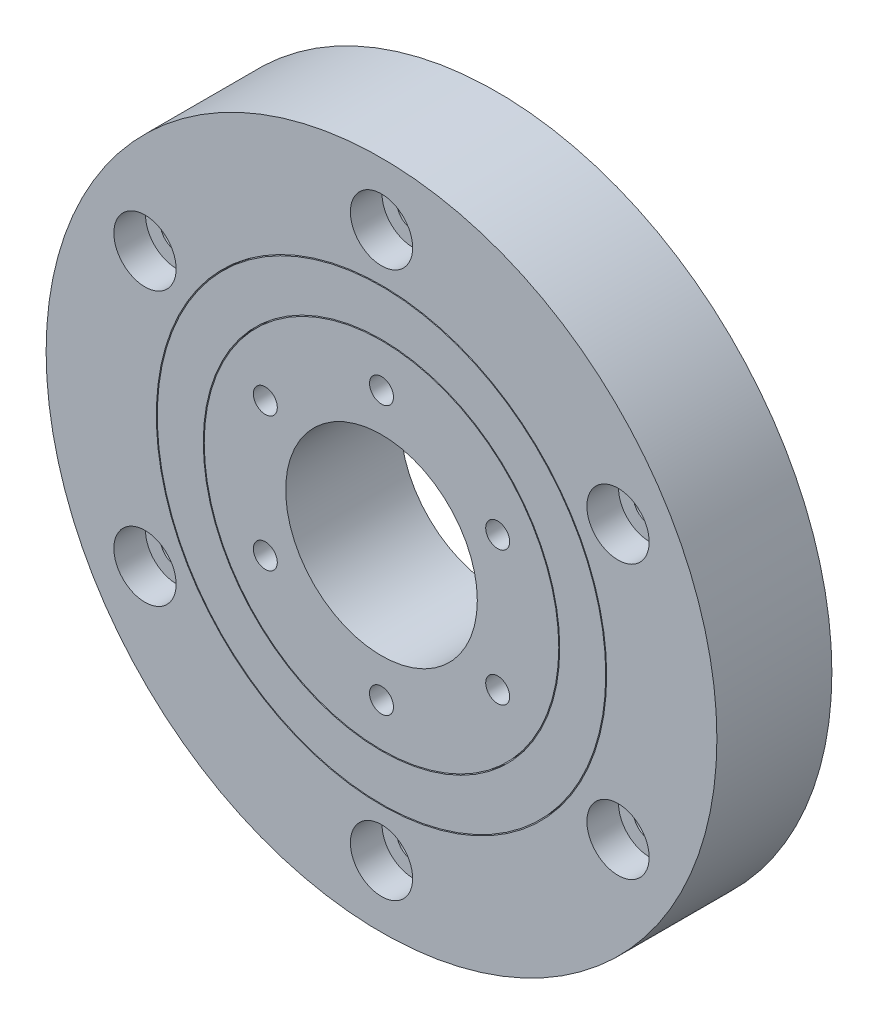
ISO-10303-21;
HEADER;
FILE_DESCRIPTION(('STEP AP214'),'2;1');
FILE_NAME('part.step','',(''),(''),'','','');
FILE_SCHEMA(('AUTOMOTIVE_DESIGN { 1 0 10303 214 1 1 1 1 }'));
ENDSEC;
DATA;
#1=APPLICATION_CONTEXT('core data for automotive mechanical design processes');
#2=APPLICATION_PROTOCOL_DEFINITION('international standard','automotive_design',2000,#1);
#3=PRODUCT_CONTEXT('',#1,'mechanical');
#4=PRODUCT('Part','Part','',(#3));
#5=PRODUCT_RELATED_PRODUCT_CATEGORY('part','',(#4));
#6=PRODUCT_DEFINITION_FORMATION('','',#4);
#7=PRODUCT_DEFINITION_CONTEXT('part definition',#1,'design');
#8=PRODUCT_DEFINITION('design','',#6,#7);
#9=PRODUCT_DEFINITION_SHAPE('','',#8);
#10=(LENGTH_UNIT() NAMED_UNIT(*) SI_UNIT(.MILLI.,.METRE.));
#11=(NAMED_UNIT(*) PLANE_ANGLE_UNIT() SI_UNIT($,.RADIAN.));
#12=(NAMED_UNIT(*) SI_UNIT($,.STERADIAN.) SOLID_ANGLE_UNIT());
#13=UNCERTAINTY_MEASURE_WITH_UNIT(LENGTH_MEASURE(1.E-05),#10,'distance_accuracy_value','');
#14=(GEOMETRIC_REPRESENTATION_CONTEXT(3) GLOBAL_UNCERTAINTY_ASSIGNED_CONTEXT((#13)) GLOBAL_UNIT_ASSIGNED_CONTEXT((#10,
#11,#12)) REPRESENTATION_CONTEXT('',''));
#15=CARTESIAN_POINT('',(0.,0.,0.));
#16=DIRECTION('',(0.,0.,1.));
#17=DIRECTION('',(1.,0.,0.));
#18=AXIS2_PLACEMENT_3D('',#15,#16,#17);
#19=CARTESIAN_POINT('',(0.,0.,11.5));
#20=DIRECTION('',(0.,0.,1.));
#21=DIRECTION('',(1.,0.,0.));
#22=AXIS2_PLACEMENT_3D('',#19,#20,#21);
#23=CYLINDRICAL_SURFACE('',#22,23.4);
#24=CARTESIAN_POINT('',(0.,0.,11.5));
#25=DIRECTION('',(0.,0.,1.));
#26=DIRECTION('',(1.,0.,0.));
#27=AXIS2_PLACEMENT_3D('',#24,#25,#26);
#28=CIRCLE('',#27,23.4);
#29=CARTESIAN_POINT('',(23.4,0.,11.5));
#30=VERTEX_POINT('',#29);
#31=EDGE_CURVE('E11',#30,#30,#28,.T.);
#32=ORIENTED_EDGE('',*,*,#31,.T.);
#33=EDGE_LOOP('',(#32));
#34=FACE_BOUND('',#33,.T.);
#35=CARTESIAN_POINT('',(0.,0.,12.));
#36=DIRECTION('',(0.,0.,1.));
#37=DIRECTION('',(1.,0.,0.));
#38=AXIS2_PLACEMENT_3D('',#35,#36,#37);
#39=CIRCLE('',#38,23.4);
#40=CARTESIAN_POINT('',(23.4,0.,12.));
#41=VERTEX_POINT('',#40);
#42=EDGE_CURVE('E51',#41,#41,#39,.T.);
#43=ORIENTED_EDGE('',*,*,#42,.F.);
#44=EDGE_LOOP('',(#43));
#45=FACE_BOUND('',#44,.T.);
#46=ADVANCED_FACE('F48',(#34,#45),#23,.T.);
#47=CARTESIAN_POINT('',(0.,0.,11.5));
#48=DIRECTION('',(0.,0.,1.));
#49=DIRECTION('',(1.,0.,0.));
#50=AXIS2_PLACEMENT_3D('',#47,#48,#49);
#51=PLANE('',#50);
#52=CARTESIAN_POINT('',(0.,0.,11.5));
#53=DIRECTION('',(0.,0.,1.));
#54=DIRECTION('',(1.,0.,0.));
#55=AXIS2_PLACEMENT_3D('',#52,#53,#54);
#56=CIRCLE('',#55,18.6);
#57=CARTESIAN_POINT('',(18.6,0.,11.5));
#58=VERTEX_POINT('',#57);
#59=EDGE_CURVE('E59',#58,#58,#56,.T.);
#60=ORIENTED_EDGE('',*,*,#59,.T.);
#61=EDGE_LOOP('',(#60));
#62=FACE_BOUND('',#61,.T.);
#63=ORIENTED_EDGE('',*,*,#31,.F.);
#64=EDGE_LOOP('',(#63));
#65=FACE_BOUND('',#64,.T.);
#66=ADVANCED_FACE('F68',(#62,#65),#51,.F.);
#67=CARTESIAN_POINT('',(0.,0.,12.));
#68=DIRECTION('',(0.,0.,1.));
#69=DIRECTION('',(1.,0.,0.));
#70=AXIS2_PLACEMENT_3D('',#67,#68,#69);
#71=PLANE('',#70);
#72=CARTESIAN_POINT('',(0.,0.,12.));
#73=DIRECTION('',(0.,0.,1.));
#74=DIRECTION('',(1.,0.,0.));
#75=AXIS2_PLACEMENT_3D('',#72,#73,#74);
#76=CIRCLE('',#75,18.6);
#77=CARTESIAN_POINT('',(18.6,0.,12.));
#78=VERTEX_POINT('',#77);
#79=EDGE_CURVE('E58',#78,#78,#76,.T.);
#80=ORIENTED_EDGE('',*,*,#79,.F.);
#81=EDGE_LOOP('',(#80));
#82=FACE_BOUND('',#81,.T.);
#83=ORIENTED_EDGE('',*,*,#42,.T.);
#84=EDGE_LOOP('',(#83));
#85=FACE_BOUND('',#84,.T.);
#86=ADVANCED_FACE('F75',(#82,#85),#71,.T.);
#87=CARTESIAN_POINT('',(0.,0.,11.5));
#88=DIRECTION('',(0.,0.,1.));
#89=DIRECTION('',(1.,0.,0.));
#90=AXIS2_PLACEMENT_3D('',#87,#88,#89);
#91=CYLINDRICAL_SURFACE('',#90,18.6);
#92=ORIENTED_EDGE('',*,*,#59,.F.);
#93=EDGE_LOOP('',(#92));
#94=FACE_BOUND('',#93,.T.);
#95=ORIENTED_EDGE('',*,*,#79,.T.);
#96=EDGE_LOOP('',(#95));
#97=FACE_BOUND('',#96,.T.);
#98=ADVANCED_FACE('F69',(#94,#97),#91,.F.);
#99=CLOSED_SHELL('',(#46,#66,#86,#98));
#100=MANIFOLD_SOLID_BREP('B2',#99);
#101=CARTESIAN_POINT('',(0.,0.,0.5));
#102=DIRECTION('',(0.,0.,1.));
#103=DIRECTION('',(1.,0.,0.));
#104=AXIS2_PLACEMENT_3D('',#101,#102,#103);
#105=PLANE('',#104);
#106=CARTESIAN_POINT('',(0.,0.,0.5));
#107=DIRECTION('',(0.,0.,1.));
#108=DIRECTION('',(1.,0.,0.));
#109=AXIS2_PLACEMENT_3D('',#106,#107,#108);
#110=CIRCLE('',#109,23.4);
#111=CARTESIAN_POINT('',(23.4,0.,0.5));
#112=VERTEX_POINT('',#111);
#113=EDGE_CURVE('E50',#112,#112,#110,.T.);
#114=ORIENTED_EDGE('',*,*,#113,.T.);
#115=EDGE_LOOP('',(#114));
#116=FACE_BOUND('',#115,.T.);
#117=CARTESIAN_POINT('',(0.,0.,0.5));
#118=DIRECTION('',(0.,0.,1.));
#119=DIRECTION('',(1.,0.,0.));
#120=AXIS2_PLACEMENT_3D('',#117,#118,#119);
#121=CIRCLE('',#120,18.6);
#122=CARTESIAN_POINT('',(18.6,0.,0.5));
#123=VERTEX_POINT('',#122);
#124=EDGE_CURVE('E129',#123,#123,#121,.T.);
#125=ORIENTED_EDGE('',*,*,#124,.F.);
#126=EDGE_LOOP('',(#125));
#127=FACE_BOUND('',#126,.T.);
#128=ADVANCED_FACE('F120',(#116,#127),#105,.T.);
#129=CARTESIAN_POINT('',(0.,0.,0.));
#130=DIRECTION('',(0.,0.,1.));
#131=DIRECTION('',(1.,0.,0.));
#132=AXIS2_PLACEMENT_3D('',#129,#130,#131);
#133=PLANE('',#132);
#134=CARTESIAN_POINT('',(0.,0.,0.));
#135=DIRECTION('',(0.,0.,1.));
#136=DIRECTION('',(1.,0.,0.));
#137=AXIS2_PLACEMENT_3D('',#134,#135,#136);
#138=CIRCLE('',#137,23.4);
#139=CARTESIAN_POINT('',(23.4,0.,0.));
#140=VERTEX_POINT('',#139);
#141=EDGE_CURVE('E125',#140,#140,#138,.T.);
#142=ORIENTED_EDGE('',*,*,#141,.F.);
#143=EDGE_LOOP('',(#142));
#144=FACE_BOUND('',#143,.T.);
#145=CARTESIAN_POINT('',(0.,0.,0.));
#146=DIRECTION('',(0.,0.,1.));
#147=DIRECTION('',(1.,0.,0.));
#148=AXIS2_PLACEMENT_3D('',#145,#146,#147);
#149=CIRCLE('',#148,18.6);
#150=CARTESIAN_POINT('',(18.6,0.,0.));
#151=VERTEX_POINT('',#150);
#152=EDGE_CURVE('E132',#151,#151,#149,.T.);
#153=ORIENTED_EDGE('',*,*,#152,.T.);
#154=EDGE_LOOP('',(#153));
#155=FACE_BOUND('',#154,.T.);
#156=ADVANCED_FACE('F143',(#144,#155),#133,.F.);
#157=CARTESIAN_POINT('',(0.,0.,0.5));
#158=DIRECTION('',(0.,0.,-1.));
#159=DIRECTION('',(-1.,0.,0.));
#160=AXIS2_PLACEMENT_3D('',#157,#158,#159);
#161=CYLINDRICAL_SURFACE('',#160,23.4);
#162=ORIENTED_EDGE('',*,*,#113,.F.);
#163=EDGE_LOOP('',(#162));
#164=FACE_BOUND('',#163,.T.);
#165=ORIENTED_EDGE('',*,*,#141,.T.);
#166=EDGE_LOOP('',(#165));
#167=FACE_BOUND('',#166,.T.);
#168=ADVANCED_FACE('F118',(#164,#167),#161,.T.);
#169=CARTESIAN_POINT('',(0.,0.,0.5));
#170=DIRECTION('',(0.,0.,-1.));
#171=DIRECTION('',(-1.,0.,0.));
#172=AXIS2_PLACEMENT_3D('',#169,#170,#171);
#173=CYLINDRICAL_SURFACE('',#172,18.6);
#174=ORIENTED_EDGE('',*,*,#124,.T.);
#175=EDGE_LOOP('',(#174));
#176=FACE_BOUND('',#175,.T.);
#177=ORIENTED_EDGE('',*,*,#152,.F.);
#178=EDGE_LOOP('',(#177));
#179=FACE_BOUND('',#178,.T.);
#180=ADVANCED_FACE('F140',(#176,#179),#173,.F.);
#181=CLOSED_SHELL('',(#128,#156,#168,#180));
#182=MANIFOLD_SOLID_BREP('B6',#181);
#183=CARTESIAN_POINT('',(24.6817240078565,14.25,0.));
#184=DIRECTION('',(0.,0.,1.));
#185=DIRECTION('',(1.,0.,0.));
#186=AXIS2_PLACEMENT_3D('',#183,#184,#185);
#187=CYLINDRICAL_SURFACE('',#186,1.7);
#188=CARTESIAN_POINT('',(24.6817240078565,14.25,0.));
#189=DIRECTION('',(0.,0.,1.));
#190=DIRECTION('',(1.,0.,0.));
#191=AXIS2_PLACEMENT_3D('',#188,#189,#190);
#192=CIRCLE('',#191,1.7);
#193=CARTESIAN_POINT('',(26.3817240078565,14.25,0.));
#194=VERTEX_POINT('',#193);
#195=EDGE_CURVE('E237',#194,#194,#192,.T.);
#196=ORIENTED_EDGE('',*,*,#195,.F.);
#197=EDGE_LOOP('',(#196));
#198=FACE_BOUND('',#197,.T.);
#199=CARTESIAN_POINT('',(24.6817240078565,14.25,8.7));
#200=DIRECTION('',(0.,0.,1.));
#201=DIRECTION('',(1.,0.,0.));
#202=AXIS2_PLACEMENT_3D('',#199,#200,#201);
#203=CIRCLE('',#202,1.7);
#204=CARTESIAN_POINT('',(26.3817240078565,14.25,8.7));
#205=VERTEX_POINT('',#204);
#206=EDGE_CURVE('E193',#205,#205,#203,.F.);
#207=ORIENTED_EDGE('',*,*,#206,.F.);
#208=EDGE_LOOP('',(#207));
#209=FACE_BOUND('',#208,.T.);
#210=ADVANCED_FACE('F189',(#198,#209),#187,.F.);
#211=CARTESIAN_POINT('',(0.,28.5,0.));
#212=DIRECTION('',(0.,0.,1.));
#213=DIRECTION('',(1.,0.,0.));
#214=AXIS2_PLACEMENT_3D('',#211,#212,#213);
#215=CYLINDRICAL_SURFACE('',#214,1.7);
#216=CARTESIAN_POINT('',(0.,28.5,0.));
#217=DIRECTION('',(0.,0.,1.));
#218=DIRECTION('',(1.,0.,0.));
#219=AXIS2_PLACEMENT_3D('',#216,#217,#218);
#220=CIRCLE('',#219,1.7);
#221=CARTESIAN_POINT('',(1.7,28.5,0.));
#222=VERTEX_POINT('',#221);
#223=EDGE_CURVE('E236',#222,#222,#220,.T.);
#224=ORIENTED_EDGE('',*,*,#223,.F.);
#225=EDGE_LOOP('',(#224));
#226=FACE_BOUND('',#225,.T.);
#227=CARTESIAN_POINT('',(0.,28.5,8.7));
#228=DIRECTION('',(0.,0.,1.));
#229=DIRECTION('',(1.,0.,0.));
#230=AXIS2_PLACEMENT_3D('',#227,#228,#229);
#231=CIRCLE('',#230,1.7);
#232=CARTESIAN_POINT('',(1.7,28.5,8.7));
#233=VERTEX_POINT('',#232);
#234=EDGE_CURVE('E217',#233,#233,#231,.F.);
#235=ORIENTED_EDGE('',*,*,#234,.F.);
#236=EDGE_LOOP('',(#235));
#237=FACE_BOUND('',#236,.T.);
#238=ADVANCED_FACE('F263',(#226,#237),#215,.F.);
#239=CARTESIAN_POINT('',(-24.6817240078565,14.25,0.));
#240=DIRECTION('',(0.,0.,1.));
#241=DIRECTION('',(1.,0.,0.));
#242=AXIS2_PLACEMENT_3D('',#239,#240,#241);
#243=CYLINDRICAL_SURFACE('',#242,1.7);
#244=CARTESIAN_POINT('',(-24.6817240078565,14.25,0.));
#245=DIRECTION('',(0.,0.,1.));
#246=DIRECTION('',(1.,0.,0.));
#247=AXIS2_PLACEMENT_3D('',#244,#245,#246);
#248=CIRCLE('',#247,1.7);
#249=CARTESIAN_POINT('',(-22.9817240078565,14.25,0.));
#250=VERTEX_POINT('',#249);
#251=EDGE_CURVE('E376',#250,#250,#248,.T.);
#252=ORIENTED_EDGE('',*,*,#251,.F.);
#253=EDGE_LOOP('',(#252));
#254=FACE_BOUND('',#253,.T.);
#255=CARTESIAN_POINT('',(-24.6817240078565,14.25,8.7));
#256=DIRECTION('',(0.,0.,1.));
#257=DIRECTION('',(1.,0.,0.));
#258=AXIS2_PLACEMENT_3D('',#255,#256,#257);
#259=CIRCLE('',#258,1.7);
#260=CARTESIAN_POINT('',(-22.9817240078565,14.25,8.7));
#261=VERTEX_POINT('',#260);
#262=EDGE_CURVE('E216',#261,#261,#259,.F.);
#263=ORIENTED_EDGE('',*,*,#262,.F.);
#264=EDGE_LOOP('',(#263));
#265=FACE_BOUND('',#264,.T.);
#266=ADVANCED_FACE('F268',(#254,#265),#243,.F.);
#267=CARTESIAN_POINT('',(-24.6817240078565,-14.25,0.));
#268=DIRECTION('',(0.,0.,1.));
#269=DIRECTION('',(1.,0.,0.));
#270=AXIS2_PLACEMENT_3D('',#267,#268,#269);
#271=CYLINDRICAL_SURFACE('',#270,1.7);
#272=CARTESIAN_POINT('',(-24.6817240078565,-14.25,0.));
#273=DIRECTION('',(0.,0.,1.));
#274=DIRECTION('',(1.,0.,0.));
#275=AXIS2_PLACEMENT_3D('',#272,#273,#274);
#276=CIRCLE('',#275,1.7);
#277=CARTESIAN_POINT('',(-22.9817240078565,-14.25,0.));
#278=VERTEX_POINT('',#277);
#279=EDGE_CURVE('E235',#278,#278,#276,.T.);
#280=ORIENTED_EDGE('',*,*,#279,.F.);
#281=EDGE_LOOP('',(#280));
#282=FACE_BOUND('',#281,.T.);
#283=CARTESIAN_POINT('',(-24.6817240078565,-14.25,8.7));
#284=DIRECTION('',(0.,0.,1.));
#285=DIRECTION('',(1.,0.,0.));
#286=AXIS2_PLACEMENT_3D('',#283,#284,#285);
#287=CIRCLE('',#286,1.7);
#288=CARTESIAN_POINT('',(-22.9817240078565,-14.25,8.7));
#289=VERTEX_POINT('',#288);
#290=EDGE_CURVE('E213',#289,#289,#287,.F.);
#291=ORIENTED_EDGE('',*,*,#290,.F.);
#292=EDGE_LOOP('',(#291));
#293=FACE_BOUND('',#292,.T.);
#294=ADVANCED_FACE('F284',(#282,#293),#271,.F.);
#295=CARTESIAN_POINT('',(0.,-28.5,0.));
#296=DIRECTION('',(0.,0.,1.));
#297=DIRECTION('',(1.,0.,0.));
#298=AXIS2_PLACEMENT_3D('',#295,#296,#297);
#299=CYLINDRICAL_SURFACE('',#298,1.7);
#300=CARTESIAN_POINT('',(0.,-28.5,0.));
#301=DIRECTION('',(0.,0.,1.));
#302=DIRECTION('',(1.,0.,0.));
#303=AXIS2_PLACEMENT_3D('',#300,#301,#302);
#304=CIRCLE('',#303,1.7);
#305=CARTESIAN_POINT('',(1.69999999999999,-28.5,0.));
#306=VERTEX_POINT('',#305);
#307=EDGE_CURVE('E229',#306,#306,#304,.T.);
#308=ORIENTED_EDGE('',*,*,#307,.F.);
#309=EDGE_LOOP('',(#308));
#310=FACE_BOUND('',#309,.T.);
#311=CARTESIAN_POINT('',(0.,-28.5,8.7));
#312=DIRECTION('',(0.,0.,1.));
#313=DIRECTION('',(1.,0.,0.));
#314=AXIS2_PLACEMENT_3D('',#311,#312,#313);
#315=CIRCLE('',#314,1.7);
#316=CARTESIAN_POINT('',(1.69999999999999,-28.5,8.7));
#317=VERTEX_POINT('',#316);
#318=EDGE_CURVE('E207',#317,#317,#315,.F.);
#319=ORIENTED_EDGE('',*,*,#318,.F.);
#320=EDGE_LOOP('',(#319));
#321=FACE_BOUND('',#320,.T.);
#322=ADVANCED_FACE('F279',(#310,#321),#299,.F.);
#323=CARTESIAN_POINT('',(24.6817240078565,-14.25,0.));
#324=DIRECTION('',(0.,0.,1.));
#325=DIRECTION('',(1.,0.,0.));
#326=AXIS2_PLACEMENT_3D('',#323,#324,#325);
#327=CYLINDRICAL_SURFACE('',#326,1.7);
#328=CARTESIAN_POINT('',(24.6817240078565,-14.25,0.));
#329=DIRECTION('',(0.,0.,1.));
#330=DIRECTION('',(1.,0.,0.));
#331=AXIS2_PLACEMENT_3D('',#328,#329,#330);
#332=CIRCLE('',#331,1.7);
#333=CARTESIAN_POINT('',(26.3817240078565,-14.25,0.));
#334=VERTEX_POINT('',#333);
#335=EDGE_CURVE('E224',#334,#334,#332,.T.);
#336=ORIENTED_EDGE('',*,*,#335,.F.);
#337=EDGE_LOOP('',(#336));
#338=FACE_BOUND('',#337,.T.);
#339=CARTESIAN_POINT('',(24.6817240078565,-14.25,8.7));
#340=DIRECTION('',(0.,0.,1.));
#341=DIRECTION('',(1.,0.,0.));
#342=AXIS2_PLACEMENT_3D('',#339,#340,#341);
#343=CIRCLE('',#342,1.7);
#344=CARTESIAN_POINT('',(26.3817240078565,-14.25,8.7));
#345=VERTEX_POINT('',#344);
#346=EDGE_CURVE('E206',#345,#345,#343,.F.);
#347=ORIENTED_EDGE('',*,*,#346,.F.);
#348=EDGE_LOOP('',(#347));
#349=FACE_BOUND('',#348,.T.);
#350=ADVANCED_FACE('F273',(#338,#349),#327,.F.);
#351=CARTESIAN_POINT('',(0.,0.,12.));
#352=DIRECTION('',(0.,0.,1.));
#353=DIRECTION('',(1.,0.,0.));
#354=AXIS2_PLACEMENT_3D('',#351,#352,#353);
#355=PLANE('',#354);
#356=CARTESIAN_POINT('',(24.6817240078565,-14.25,12.));
#357=DIRECTION('',(0.,0.,1.));
#358=DIRECTION('',(1.,0.,0.));
#359=AXIS2_PLACEMENT_3D('',#356,#357,#358);
#360=CIRCLE('',#359,3.25);
#361=CARTESIAN_POINT('',(27.9317240078565,-14.25,12.));
#362=VERTEX_POINT('',#361);
#363=EDGE_CURVE('E368',#362,#362,#360,.T.);
#364=ORIENTED_EDGE('',*,*,#363,.F.);
#365=EDGE_LOOP('',(#364));
#366=FACE_BOUND('',#365,.T.);
#367=CARTESIAN_POINT('',(0.,-28.5,12.));
#368=DIRECTION('',(0.,0.,1.));
#369=DIRECTION('',(1.,0.,0.));
#370=AXIS2_PLACEMENT_3D('',#367,#368,#369);
#371=CIRCLE('',#370,3.25);
#372=CARTESIAN_POINT('',(3.24999999999999,-28.5,12.));
#373=VERTEX_POINT('',#372);
#374=EDGE_CURVE('E357',#373,#373,#371,.T.);
#375=ORIENTED_EDGE('',*,*,#374,.F.);
#376=EDGE_LOOP('',(#375));
#377=FACE_BOUND('',#376,.T.);
#378=CARTESIAN_POINT('',(-24.6817240078565,-14.25,12.));
#379=DIRECTION('',(0.,0.,1.));
#380=DIRECTION('',(1.,0.,0.));
#381=AXIS2_PLACEMENT_3D('',#378,#379,#380);
#382=CIRCLE('',#381,3.25);
#383=CARTESIAN_POINT('',(-21.4317240078565,-14.25,12.));
#384=VERTEX_POINT('',#383);
#385=EDGE_CURVE('E351',#384,#384,#382,.T.);
#386=ORIENTED_EDGE('',*,*,#385,.F.);
#387=EDGE_LOOP('',(#386));
#388=FACE_BOUND('',#387,.T.);
#389=CARTESIAN_POINT('',(-24.6817240078565,14.25,12.));
#390=DIRECTION('',(0.,0.,1.));
#391=DIRECTION('',(1.,0.,0.));
#392=AXIS2_PLACEMENT_3D('',#389,#390,#391);
#393=CIRCLE('',#392,3.25);
#394=CARTESIAN_POINT('',(-21.4317240078565,14.25,12.));
#395=VERTEX_POINT('',#394);
#396=EDGE_CURVE('E347',#395,#395,#393,.T.);
#397=ORIENTED_EDGE('',*,*,#396,.F.);
#398=EDGE_LOOP('',(#397));
#399=FACE_BOUND('',#398,.T.);
#400=CARTESIAN_POINT('',(0.,28.5,12.));
#401=DIRECTION('',(0.,0.,1.));
#402=DIRECTION('',(1.,0.,0.));
#403=AXIS2_PLACEMENT_3D('',#400,#401,#402);
#404=CIRCLE('',#403,3.25);
#405=CARTESIAN_POINT('',(3.25,28.5,12.));
#406=VERTEX_POINT('',#405);
#407=EDGE_CURVE('E338',#406,#406,#404,.T.);
#408=ORIENTED_EDGE('',*,*,#407,.F.);
#409=EDGE_LOOP('',(#408));
#410=FACE_BOUND('',#409,.T.);
#411=CARTESIAN_POINT('',(24.6817240078565,14.25,12.));
#412=DIRECTION('',(0.,0.,1.));
#413=DIRECTION('',(1.,0.,0.));
#414=AXIS2_PLACEMENT_3D('',#411,#412,#413);
#415=CIRCLE('',#414,3.25);
#416=CARTESIAN_POINT('',(27.9317240078565,14.25,12.));
#417=VERTEX_POINT('',#416);
#418=EDGE_CURVE('E345',#417,#417,#415,.T.);
#419=ORIENTED_EDGE('',*,*,#418,.F.);
#420=EDGE_LOOP('',(#419));
#421=FACE_BOUND('',#420,.T.);
#422=CARTESIAN_POINT('',(0.,0.,12.));
#423=DIRECTION('',(0.,0.,1.));
#424=DIRECTION('',(1.,0.,0.));
#425=AXIS2_PLACEMENT_3D('',#422,#423,#424);
#426=CIRCLE('',#425,35.);
#427=CARTESIAN_POINT('',(35.,0.,12.));
#428=VERTEX_POINT('',#427);
#429=EDGE_CURVE('E119',#428,#428,#426,.T.);
#430=ORIENTED_EDGE('',*,*,#429,.T.);
#431=EDGE_LOOP('',(#430));
#432=FACE_BOUND('',#431,.T.);
#433=CARTESIAN_POINT('',(0.,0.,12.));
#434=DIRECTION('',(0.,0.,1.));
#435=DIRECTION('',(1.,0.,0.));
#436=AXIS2_PLACEMENT_3D('',#433,#434,#435);
#437=CIRCLE('',#436,23.5);
#438=CARTESIAN_POINT('',(23.5,0.,12.));
#439=VERTEX_POINT('',#438);
#440=EDGE_CURVE('E199',#439,#439,#437,.T.);
#441=ORIENTED_EDGE('',*,*,#440,.F.);
#442=EDGE_LOOP('',(#441));
#443=FACE_BOUND('',#442,.T.);
#444=ADVANCED_FACE('F280',(#366,#377,#388,#399,#410,#421,#432,#443),#355,.T.);
#445=CARTESIAN_POINT('',(0.,0.,0.));
#446=DIRECTION('',(0.,0.,1.));
#447=DIRECTION('',(1.,0.,0.));
#448=AXIS2_PLACEMENT_3D('',#445,#446,#447);
#449=PLANE('',#448);
#450=ORIENTED_EDGE('',*,*,#335,.T.);
#451=EDGE_LOOP('',(#450));
#452=FACE_BOUND('',#451,.T.);
#453=ORIENTED_EDGE('',*,*,#307,.T.);
#454=EDGE_LOOP('',(#453));
#455=FACE_BOUND('',#454,.T.);
#456=ORIENTED_EDGE('',*,*,#279,.T.);
#457=EDGE_LOOP('',(#456));
#458=FACE_BOUND('',#457,.T.);
#459=ORIENTED_EDGE('',*,*,#251,.T.);
#460=EDGE_LOOP('',(#459));
#461=FACE_BOUND('',#460,.T.);
#462=ORIENTED_EDGE('',*,*,#223,.T.);
#463=EDGE_LOOP('',(#462));
#464=FACE_BOUND('',#463,.T.);
#465=ORIENTED_EDGE('',*,*,#195,.T.);
#466=EDGE_LOOP('',(#465));
#467=FACE_BOUND('',#466,.T.);
#468=CARTESIAN_POINT('',(0.,0.,0.));
#469=DIRECTION('',(0.,0.,1.));
#470=DIRECTION('',(1.,0.,0.));
#471=AXIS2_PLACEMENT_3D('',#468,#469,#470);
#472=CIRCLE('',#471,35.);
#473=CARTESIAN_POINT('',(35.,0.,0.));
#474=VERTEX_POINT('',#473);
#475=EDGE_CURVE('E192',#474,#474,#472,.T.);
#476=ORIENTED_EDGE('',*,*,#475,.F.);
#477=EDGE_LOOP('',(#476));
#478=FACE_BOUND('',#477,.T.);
#479=CARTESIAN_POINT('',(0.,0.,0.));
#480=DIRECTION('',(0.,0.,1.));
#481=DIRECTION('',(1.,0.,0.));
#482=AXIS2_PLACEMENT_3D('',#479,#480,#481);
#483=CIRCLE('',#482,23.5);
#484=CARTESIAN_POINT('',(23.5,0.,0.));
#485=VERTEX_POINT('',#484);
#486=EDGE_CURVE('E201',#485,#485,#483,.T.);
#487=ORIENTED_EDGE('',*,*,#486,.T.);
#488=EDGE_LOOP('',(#487));
#489=FACE_BOUND('',#488,.T.);
#490=ADVANCED_FACE('F243',(#452,#455,#458,#461,#464,#467,#478,#489),#449,.F.);
#491=CARTESIAN_POINT('',(0.,0.,12.));
#492=DIRECTION('',(0.,0.,-1.));
#493=DIRECTION('',(-1.,0.,0.));
#494=AXIS2_PLACEMENT_3D('',#491,#492,#493);
#495=CYLINDRICAL_SURFACE('',#494,35.);
#496=ORIENTED_EDGE('',*,*,#429,.F.);
#497=EDGE_LOOP('',(#496));
#498=FACE_BOUND('',#497,.T.);
#499=ORIENTED_EDGE('',*,*,#475,.T.);
#500=EDGE_LOOP('',(#499));
#501=FACE_BOUND('',#500,.T.);
#502=ADVANCED_FACE('F186',(#498,#501),#495,.T.);
#503=CARTESIAN_POINT('',(0.,0.,12.));
#504=DIRECTION('',(0.,0.,-1.));
#505=DIRECTION('',(-1.,0.,0.));
#506=AXIS2_PLACEMENT_3D('',#503,#504,#505);
#507=CYLINDRICAL_SURFACE('',#506,23.5);
#508=ORIENTED_EDGE('',*,*,#440,.T.);
#509=EDGE_LOOP('',(#508));
#510=FACE_BOUND('',#509,.T.);
#511=ORIENTED_EDGE('',*,*,#486,.F.);
#512=EDGE_LOOP('',(#511));
#513=FACE_BOUND('',#512,.T.);
#514=ADVANCED_FACE('F250',(#510,#513),#507,.F.);
#515=CARTESIAN_POINT('',(24.6817240078565,-14.25,8.7));
#516=DIRECTION('',(0.,0.,1.));
#517=DIRECTION('',(1.,0.,0.));
#518=AXIS2_PLACEMENT_3D('',#515,#516,#517);
#519=PLANE('',#518);
#520=CARTESIAN_POINT('',(24.6817240078565,-14.25,8.7));
#521=DIRECTION('',(0.,0.,1.));
#522=DIRECTION('',(1.,0.,0.));
#523=AXIS2_PLACEMENT_3D('',#520,#521,#522);
#524=CIRCLE('',#523,3.25);
#525=CARTESIAN_POINT('',(27.9317240078565,-14.25,8.7));
#526=VERTEX_POINT('',#525);
#527=EDGE_CURVE('E369',#526,#526,#524,.T.);
#528=ORIENTED_EDGE('',*,*,#527,.T.);
#529=EDGE_LOOP('',(#528));
#530=FACE_BOUND('',#529,.T.);
#531=ORIENTED_EDGE('',*,*,#346,.T.);
#532=EDGE_LOOP('',(#531));
#533=FACE_BOUND('',#532,.T.);
#534=ADVANCED_FACE('F249',(#530,#533),#519,.T.);
#535=CARTESIAN_POINT('',(24.6817240078565,-14.25,8.7));
#536=DIRECTION('',(0.,0.,1.));
#537=DIRECTION('',(1.,0.,0.));
#538=AXIS2_PLACEMENT_3D('',#535,#536,#537);
#539=CYLINDRICAL_SURFACE('',#538,3.25);
#540=ORIENTED_EDGE('',*,*,#527,.F.);
#541=EDGE_LOOP('',(#540));
#542=FACE_BOUND('',#541,.T.);
#543=ORIENTED_EDGE('',*,*,#363,.T.);
#544=EDGE_LOOP('',(#543));
#545=FACE_BOUND('',#544,.T.);
#546=ADVANCED_FACE('F258',(#542,#545),#539,.F.);
#547=CARTESIAN_POINT('',(0.,-28.5,8.7));
#548=DIRECTION('',(0.,0.,1.));
#549=DIRECTION('',(1.,0.,0.));
#550=AXIS2_PLACEMENT_3D('',#547,#548,#549);
#551=PLANE('',#550);
#552=CARTESIAN_POINT('',(0.,-28.5,8.7));
#553=DIRECTION('',(0.,0.,1.));
#554=DIRECTION('',(1.,0.,0.));
#555=AXIS2_PLACEMENT_3D('',#552,#553,#554);
#556=CIRCLE('',#555,3.25);
#557=CARTESIAN_POINT('',(3.24999999999999,-28.5,8.7));
#558=VERTEX_POINT('',#557);
#559=EDGE_CURVE('E361',#558,#558,#556,.T.);
#560=ORIENTED_EDGE('',*,*,#559,.T.);
#561=EDGE_LOOP('',(#560));
#562=FACE_BOUND('',#561,.T.);
#563=ORIENTED_EDGE('',*,*,#318,.T.);
#564=EDGE_LOOP('',(#563));
#565=FACE_BOUND('',#564,.T.);
#566=ADVANCED_FACE('F303',(#562,#565),#551,.T.);
#567=CARTESIAN_POINT('',(0.,-28.5,8.7));
#568=DIRECTION('',(0.,0.,1.));
#569=DIRECTION('',(1.,0.,0.));
#570=AXIS2_PLACEMENT_3D('',#567,#568,#569);
#571=CYLINDRICAL_SURFACE('',#570,3.25);
#572=ORIENTED_EDGE('',*,*,#559,.F.);
#573=EDGE_LOOP('',(#572));
#574=FACE_BOUND('',#573,.T.);
#575=ORIENTED_EDGE('',*,*,#374,.T.);
#576=EDGE_LOOP('',(#575));
#577=FACE_BOUND('',#576,.T.);
#578=ADVANCED_FACE('F302',(#574,#577),#571,.F.);
#579=CARTESIAN_POINT('',(-24.6817240078565,-14.25,8.7));
#580=DIRECTION('',(0.,0.,1.));
#581=DIRECTION('',(1.,0.,0.));
#582=AXIS2_PLACEMENT_3D('',#579,#580,#581);
#583=PLANE('',#582);
#584=CARTESIAN_POINT('',(-24.6817240078565,-14.25,8.7));
#585=DIRECTION('',(0.,0.,1.));
#586=DIRECTION('',(1.,0.,0.));
#587=AXIS2_PLACEMENT_3D('',#584,#585,#586);
#588=CIRCLE('',#587,3.25);
#589=CARTESIAN_POINT('',(-21.4317240078565,-14.25,8.7));
#590=VERTEX_POINT('',#589);
#591=EDGE_CURVE('E360',#590,#590,#588,.T.);
#592=ORIENTED_EDGE('',*,*,#591,.T.);
#593=EDGE_LOOP('',(#592));
#594=FACE_BOUND('',#593,.T.);
#595=ORIENTED_EDGE('',*,*,#290,.T.);
#596=EDGE_LOOP('',(#595));
#597=FACE_BOUND('',#596,.T.);
#598=ADVANCED_FACE('F310',(#594,#597),#583,.T.);
#599=CARTESIAN_POINT('',(-24.6817240078565,-14.25,8.7));
#600=DIRECTION('',(0.,0.,1.));
#601=DIRECTION('',(1.,0.,0.));
#602=AXIS2_PLACEMENT_3D('',#599,#600,#601);
#603=CYLINDRICAL_SURFACE('',#602,3.25);
#604=ORIENTED_EDGE('',*,*,#591,.F.);
#605=EDGE_LOOP('',(#604));
#606=FACE_BOUND('',#605,.T.);
#607=ORIENTED_EDGE('',*,*,#385,.T.);
#608=EDGE_LOOP('',(#607));
#609=FACE_BOUND('',#608,.T.);
#610=ADVANCED_FACE('F311',(#606,#609),#603,.F.);
#611=CARTESIAN_POINT('',(-24.6817240078565,14.25,8.7));
#612=DIRECTION('',(0.,0.,1.));
#613=DIRECTION('',(1.,0.,0.));
#614=AXIS2_PLACEMENT_3D('',#611,#612,#613);
#615=PLANE('',#614);
#616=CARTESIAN_POINT('',(-24.6817240078565,14.25,8.7));
#617=DIRECTION('',(0.,0.,1.));
#618=DIRECTION('',(1.,0.,0.));
#619=AXIS2_PLACEMENT_3D('',#616,#617,#618);
#620=CIRCLE('',#619,3.25);
#621=CARTESIAN_POINT('',(-21.4317240078565,14.25,8.7));
#622=VERTEX_POINT('',#621);
#623=EDGE_CURVE('E352',#622,#622,#620,.T.);
#624=ORIENTED_EDGE('',*,*,#623,.T.);
#625=EDGE_LOOP('',(#624));
#626=FACE_BOUND('',#625,.T.);
#627=ORIENTED_EDGE('',*,*,#262,.T.);
#628=EDGE_LOOP('',(#627));
#629=FACE_BOUND('',#628,.T.);
#630=ADVANCED_FACE('F320',(#626,#629),#615,.T.);
#631=CARTESIAN_POINT('',(-24.6817240078565,14.25,8.7));
#632=DIRECTION('',(0.,0.,1.));
#633=DIRECTION('',(1.,0.,0.));
#634=AXIS2_PLACEMENT_3D('',#631,#632,#633);
#635=CYLINDRICAL_SURFACE('',#634,3.25);
#636=ORIENTED_EDGE('',*,*,#623,.F.);
#637=EDGE_LOOP('',(#636));
#638=FACE_BOUND('',#637,.T.);
#639=ORIENTED_EDGE('',*,*,#396,.T.);
#640=EDGE_LOOP('',(#639));
#641=FACE_BOUND('',#640,.T.);
#642=ADVANCED_FACE('F321',(#638,#641),#635,.F.);
#643=CARTESIAN_POINT('',(0.,28.5,8.7));
#644=DIRECTION('',(0.,0.,1.));
#645=DIRECTION('',(1.,0.,0.));
#646=AXIS2_PLACEMENT_3D('',#643,#644,#645);
#647=PLANE('',#646);
#648=CARTESIAN_POINT('',(0.,28.5,8.7));
#649=DIRECTION('',(0.,0.,1.));
#650=DIRECTION('',(1.,0.,0.));
#651=AXIS2_PLACEMENT_3D('',#648,#649,#650);
#652=CIRCLE('',#651,3.25);
#653=CARTESIAN_POINT('',(3.25,28.5,8.7));
#654=VERTEX_POINT('',#653);
#655=EDGE_CURVE('E339',#654,#654,#652,.T.);
#656=ORIENTED_EDGE('',*,*,#655,.T.);
#657=EDGE_LOOP('',(#656));
#658=FACE_BOUND('',#657,.T.);
#659=ORIENTED_EDGE('',*,*,#234,.T.);
#660=EDGE_LOOP('',(#659));
#661=FACE_BOUND('',#660,.T.);
#662=ADVANCED_FACE('F324',(#658,#661),#647,.T.);
#663=CARTESIAN_POINT('',(0.,28.5,8.7));
#664=DIRECTION('',(0.,0.,1.));
#665=DIRECTION('',(1.,0.,0.));
#666=AXIS2_PLACEMENT_3D('',#663,#664,#665);
#667=CYLINDRICAL_SURFACE('',#666,3.25);
#668=ORIENTED_EDGE('',*,*,#655,.F.);
#669=EDGE_LOOP('',(#668));
#670=FACE_BOUND('',#669,.T.);
#671=ORIENTED_EDGE('',*,*,#407,.T.);
#672=EDGE_LOOP('',(#671));
#673=FACE_BOUND('',#672,.T.);
#674=ADVANCED_FACE('F297',(#670,#673),#667,.F.);
#675=CARTESIAN_POINT('',(24.6817240078565,14.25,8.7));
#676=DIRECTION('',(0.,0.,1.));
#677=DIRECTION('',(1.,0.,0.));
#678=AXIS2_PLACEMENT_3D('',#675,#676,#677);
#679=PLANE('',#678);
#680=CARTESIAN_POINT('',(24.6817240078565,14.25,8.7));
#681=DIRECTION('',(0.,0.,1.));
#682=DIRECTION('',(1.,0.,0.));
#683=AXIS2_PLACEMENT_3D('',#680,#681,#682);
#684=CIRCLE('',#683,3.25);
#685=CARTESIAN_POINT('',(27.9317240078565,14.25,8.7));
#686=VERTEX_POINT('',#685);
#687=EDGE_CURVE('E209',#686,#686,#684,.T.);
#688=ORIENTED_EDGE('',*,*,#687,.T.);
#689=EDGE_LOOP('',(#688));
#690=FACE_BOUND('',#689,.T.);
#691=ORIENTED_EDGE('',*,*,#206,.T.);
#692=EDGE_LOOP('',(#691));
#693=FACE_BOUND('',#692,.T.);
#694=ADVANCED_FACE('F291',(#690,#693),#679,.T.);
#695=CARTESIAN_POINT('',(24.6817240078565,14.25,8.7));
#696=DIRECTION('',(0.,0.,1.));
#697=DIRECTION('',(1.,0.,0.));
#698=AXIS2_PLACEMENT_3D('',#695,#696,#697);
#699=CYLINDRICAL_SURFACE('',#698,3.25);
#700=ORIENTED_EDGE('',*,*,#687,.F.);
#701=EDGE_LOOP('',(#700));
#702=FACE_BOUND('',#701,.T.);
#703=ORIENTED_EDGE('',*,*,#418,.T.);
#704=EDGE_LOOP('',(#703));
#705=FACE_BOUND('',#704,.T.);
#706=ADVANCED_FACE('F287',(#702,#705),#699,.F.);
#707=CLOSED_SHELL('',(#210,#238,#266,#294,#322,#350,#444,#490,#502,#514,#534,#546,#566,#578,
#598,#610,#630,#642,#662,#674,#694,#706));
#708=MANIFOLD_SOLID_BREP('B45',#707);
#709=CARTESIAN_POINT('',(0.,0.,12.));
#710=DIRECTION('',(0.,0.,1.));
#711=DIRECTION('',(1.,0.,0.));
#712=AXIS2_PLACEMENT_3D('',#709,#710,#711);
#713=PLANE('',#712);
#714=CARTESIAN_POINT('',(12.1243556529821,-7.,12.));
#715=DIRECTION('',(0.,0.,1.));
#716=DIRECTION('',(1.,0.,0.));
#717=AXIS2_PLACEMENT_3D('',#714,#715,#716);
#718=CIRCLE('',#717,1.25);
#719=CARTESIAN_POINT('',(13.3743556529821,-7.,12.));
#720=VERTEX_POINT('',#719);
#721=EDGE_CURVE('E581',#720,#720,#718,.T.);
#722=ORIENTED_EDGE('',*,*,#721,.F.);
#723=EDGE_LOOP('',(#722));
#724=FACE_BOUND('',#723,.T.);
#725=CARTESIAN_POINT('',(0.,-14.,12.));
#726=DIRECTION('',(0.,0.,1.));
#727=DIRECTION('',(1.,0.,0.));
#728=AXIS2_PLACEMENT_3D('',#725,#726,#727);
#729=CIRCLE('',#728,1.25);
#730=CARTESIAN_POINT('',(1.25,-14.,12.));
#731=VERTEX_POINT('',#730);
#732=EDGE_CURVE('E589',#731,#731,#729,.T.);
#733=ORIENTED_EDGE('',*,*,#732,.F.);
#734=EDGE_LOOP('',(#733));
#735=FACE_BOUND('',#734,.T.);
#736=CARTESIAN_POINT('',(-12.1243556529821,-7.,12.));
#737=DIRECTION('',(0.,0.,1.));
#738=DIRECTION('',(1.,0.,0.));
#739=AXIS2_PLACEMENT_3D('',#736,#737,#738);
#740=CIRCLE('',#739,1.25);
#741=CARTESIAN_POINT('',(-10.8743556529821,-7.,12.));
#742=VERTEX_POINT('',#741);
#743=EDGE_CURVE('E594',#742,#742,#740,.T.);
#744=ORIENTED_EDGE('',*,*,#743,.F.);
#745=EDGE_LOOP('',(#744));
#746=FACE_BOUND('',#745,.T.);
#747=CARTESIAN_POINT('',(-12.1243556529821,7.,12.));
#748=DIRECTION('',(0.,0.,1.));
#749=DIRECTION('',(1.,0.,0.));
#750=AXIS2_PLACEMENT_3D('',#747,#748,#749);
#751=CIRCLE('',#750,1.25);
#752=CARTESIAN_POINT('',(-10.8743556529821,7.,12.));
#753=VERTEX_POINT('',#752);
#754=EDGE_CURVE('E601',#753,#753,#751,.T.);
#755=ORIENTED_EDGE('',*,*,#754,.F.);
#756=EDGE_LOOP('',(#755));
#757=FACE_BOUND('',#756,.T.);
#758=CARTESIAN_POINT('',(0.,14.,12.));
#759=DIRECTION('',(0.,0.,1.));
#760=DIRECTION('',(1.,0.,0.));
#761=AXIS2_PLACEMENT_3D('',#758,#759,#760);
#762=CIRCLE('',#761,1.25);
#763=CARTESIAN_POINT('',(1.25,14.,12.));
#764=VERTEX_POINT('',#763);
#765=EDGE_CURVE('E580',#764,#764,#762,.T.);
#766=ORIENTED_EDGE('',*,*,#765,.F.);
#767=EDGE_LOOP('',(#766));
#768=FACE_BOUND('',#767,.T.);
#769=CARTESIAN_POINT('',(12.1243556529821,7.,12.));
#770=DIRECTION('',(0.,0.,1.));
#771=DIRECTION('',(1.,0.,0.));
#772=AXIS2_PLACEMENT_3D('',#769,#770,#771);
#773=CIRCLE('',#772,1.25);
#774=CARTESIAN_POINT('',(13.3743556529821,7.,12.));
#775=VERTEX_POINT('',#774);
#776=EDGE_CURVE('E571',#775,#775,#773,.T.);
#777=ORIENTED_EDGE('',*,*,#776,.F.);
#778=EDGE_LOOP('',(#777));
#779=FACE_BOUND('',#778,.T.);
#780=CARTESIAN_POINT('',(0.,0.,12.));
#781=DIRECTION('',(0.,0.,1.));
#782=DIRECTION('',(1.,0.,0.));
#783=AXIS2_PLACEMENT_3D('',#780,#781,#782);
#784=CIRCLE('',#783,18.5);
#785=CARTESIAN_POINT('',(18.5,0.,12.));
#786=VERTEX_POINT('',#785);
#787=EDGE_CURVE('E187',#786,#786,#784,.T.);
#788=ORIENTED_EDGE('',*,*,#787,.T.);
#789=EDGE_LOOP('',(#788));
#790=FACE_BOUND('',#789,.T.);
#791=CARTESIAN_POINT('',(0.,0.,12.));
#792=DIRECTION('',(0.,0.,1.));
#793=DIRECTION('',(1.,0.,0.));
#794=AXIS2_PLACEMENT_3D('',#791,#792,#793);
#795=CIRCLE('',#794,10.);
#796=CARTESIAN_POINT('',(10.,0.,12.));
#797=VERTEX_POINT('',#796);
#798=EDGE_CURVE('E567',#797,#797,#795,.T.);
#799=ORIENTED_EDGE('',*,*,#798,.F.);
#800=EDGE_LOOP('',(#799));
#801=FACE_BOUND('',#800,.T.);
#802=ADVANCED_FACE('F553',(#724,#735,#746,#757,#768,#779,#790,#801),#713,.T.);
#803=CARTESIAN_POINT('',(0.,0.,0.));
#804=DIRECTION('',(0.,0.,1.));
#805=DIRECTION('',(1.,0.,0.));
#806=AXIS2_PLACEMENT_3D('',#803,#804,#805);
#807=PLANE('',#806);
#808=CARTESIAN_POINT('',(12.1243556529821,-7.,0.));
#809=DIRECTION('',(0.,0.,1.));
#810=DIRECTION('',(1.,0.,0.));
#811=AXIS2_PLACEMENT_3D('',#808,#809,#810);
#812=CIRCLE('',#811,1.25);
#813=CARTESIAN_POINT('',(13.3743556529821,-7.,0.));
#814=VERTEX_POINT('',#813);
#815=EDGE_CURVE('E577',#814,#814,#812,.T.);
#816=ORIENTED_EDGE('',*,*,#815,.T.);
#817=EDGE_LOOP('',(#816));
#818=FACE_BOUND('',#817,.T.);
#819=CARTESIAN_POINT('',(0.,-14.,0.));
#820=DIRECTION('',(0.,0.,1.));
#821=DIRECTION('',(1.,0.,0.));
#822=AXIS2_PLACEMENT_3D('',#819,#820,#821);
#823=CIRCLE('',#822,1.25);
#824=CARTESIAN_POINT('',(1.25,-14.,0.));
#825=VERTEX_POINT('',#824);
#826=EDGE_CURVE('E588',#825,#825,#823,.T.);
#827=ORIENTED_EDGE('',*,*,#826,.T.);
#828=EDGE_LOOP('',(#827));
#829=FACE_BOUND('',#828,.T.);
#830=CARTESIAN_POINT('',(-12.1243556529821,-7.,0.));
#831=DIRECTION('',(0.,0.,1.));
#832=DIRECTION('',(1.,0.,0.));
#833=AXIS2_PLACEMENT_3D('',#830,#831,#832);
#834=CIRCLE('',#833,1.25);
#835=CARTESIAN_POINT('',(-10.8743556529821,-7.,0.));
#836=VERTEX_POINT('',#835);
#837=EDGE_CURVE('E595',#836,#836,#834,.T.);
#838=ORIENTED_EDGE('',*,*,#837,.T.);
#839=EDGE_LOOP('',(#838));
#840=FACE_BOUND('',#839,.T.);
#841=CARTESIAN_POINT('',(-12.1243556529821,7.,0.));
#842=DIRECTION('',(0.,0.,1.));
#843=DIRECTION('',(1.,0.,0.));
#844=AXIS2_PLACEMENT_3D('',#841,#842,#843);
#845=CIRCLE('',#844,1.25);
#846=CARTESIAN_POINT('',(-10.8743556529821,7.,0.));
#847=VERTEX_POINT('',#846);
#848=EDGE_CURVE('E598',#847,#847,#845,.T.);
#849=ORIENTED_EDGE('',*,*,#848,.T.);
#850=EDGE_LOOP('',(#849));
#851=FACE_BOUND('',#850,.T.);
#852=CARTESIAN_POINT('',(0.,14.,0.));
#853=DIRECTION('',(0.,0.,1.));
#854=DIRECTION('',(1.,0.,0.));
#855=AXIS2_PLACEMENT_3D('',#852,#853,#854);
#856=CIRCLE('',#855,1.25);
#857=CARTESIAN_POINT('',(1.25,14.,0.));
#858=VERTEX_POINT('',#857);
#859=EDGE_CURVE('E603',#858,#858,#856,.T.);
#860=ORIENTED_EDGE('',*,*,#859,.T.);
#861=EDGE_LOOP('',(#860));
#862=FACE_BOUND('',#861,.T.);
#863=CARTESIAN_POINT('',(12.1243556529821,7.,0.));
#864=DIRECTION('',(0.,0.,1.));
#865=DIRECTION('',(1.,0.,0.));
#866=AXIS2_PLACEMENT_3D('',#863,#864,#865);
#867=CIRCLE('',#866,1.25);
#868=CARTESIAN_POINT('',(13.3743556529821,7.,0.));
#869=VERTEX_POINT('',#868);
#870=EDGE_CURVE('E572',#869,#869,#867,.T.);
#871=ORIENTED_EDGE('',*,*,#870,.T.);
#872=EDGE_LOOP('',(#871));
#873=FACE_BOUND('',#872,.T.);
#874=CARTESIAN_POINT('',(0.,0.,0.));
#875=DIRECTION('',(0.,0.,1.));
#876=DIRECTION('',(1.,0.,0.));
#877=AXIS2_PLACEMENT_3D('',#874,#875,#876);
#878=CIRCLE('',#877,18.5);
#879=CARTESIAN_POINT('',(18.5,0.,0.));
#880=VERTEX_POINT('',#879);
#881=EDGE_CURVE('E556',#880,#880,#878,.T.);
#882=ORIENTED_EDGE('',*,*,#881,.F.);
#883=EDGE_LOOP('',(#882));
#884=FACE_BOUND('',#883,.T.);
#885=CARTESIAN_POINT('',(0.,0.,0.));
#886=DIRECTION('',(0.,0.,1.));
#887=DIRECTION('',(1.,0.,0.));
#888=AXIS2_PLACEMENT_3D('',#885,#886,#887);
#889=CIRCLE('',#888,10.);
#890=CARTESIAN_POINT('',(10.,0.,0.));
#891=VERTEX_POINT('',#890);
#892=EDGE_CURVE('E566',#891,#891,#889,.T.);
#893=ORIENTED_EDGE('',*,*,#892,.T.);
#894=EDGE_LOOP('',(#893));
#895=FACE_BOUND('',#894,.T.);
#896=ADVANCED_FACE('F611',(#818,#829,#840,#851,#862,#873,#884,#895),#807,.F.);
#897=CARTESIAN_POINT('',(0.,0.,12.));
#898=DIRECTION('',(0.,0.,-1.));
#899=DIRECTION('',(-1.,0.,0.));
#900=AXIS2_PLACEMENT_3D('',#897,#898,#899);
#901=CYLINDRICAL_SURFACE('',#900,18.5);
#902=ORIENTED_EDGE('',*,*,#787,.F.);
#903=EDGE_LOOP('',(#902));
#904=FACE_BOUND('',#903,.T.);
#905=ORIENTED_EDGE('',*,*,#881,.T.);
#906=EDGE_LOOP('',(#905));
#907=FACE_BOUND('',#906,.T.);
#908=ADVANCED_FACE('F559',(#904,#907),#901,.T.);
#909=CARTESIAN_POINT('',(0.,0.,12.));
#910=DIRECTION('',(0.,0.,-1.));
#911=DIRECTION('',(-1.,0.,0.));
#912=AXIS2_PLACEMENT_3D('',#909,#910,#911);
#913=CYLINDRICAL_SURFACE('',#912,10.);
#914=ORIENTED_EDGE('',*,*,#798,.T.);
#915=EDGE_LOOP('',(#914));
#916=FACE_BOUND('',#915,.T.);
#917=ORIENTED_EDGE('',*,*,#892,.F.);
#918=EDGE_LOOP('',(#917));
#919=FACE_BOUND('',#918,.T.);
#920=ADVANCED_FACE('F622',(#916,#919),#913,.F.);
#921=CARTESIAN_POINT('',(12.1243556529821,7.,0.));
#922=DIRECTION('',(0.,0.,1.));
#923=DIRECTION('',(1.,0.,0.));
#924=AXIS2_PLACEMENT_3D('',#921,#922,#923);
#925=CYLINDRICAL_SURFACE('',#924,1.25);
#926=ORIENTED_EDGE('',*,*,#870,.F.);
#927=EDGE_LOOP('',(#926));
#928=FACE_BOUND('',#927,.T.);
#929=ORIENTED_EDGE('',*,*,#776,.T.);
#930=EDGE_LOOP('',(#929));
#931=FACE_BOUND('',#930,.T.);
#932=ADVANCED_FACE('F624',(#928,#931),#925,.F.);
#933=CARTESIAN_POINT('',(0.,14.,0.));
#934=DIRECTION('',(0.,0.,1.));
#935=DIRECTION('',(1.,0.,0.));
#936=AXIS2_PLACEMENT_3D('',#933,#934,#935);
#937=CYLINDRICAL_SURFACE('',#936,1.25);
#938=ORIENTED_EDGE('',*,*,#859,.F.);
#939=EDGE_LOOP('',(#938));
#940=FACE_BOUND('',#939,.T.);
#941=ORIENTED_EDGE('',*,*,#765,.T.);
#942=EDGE_LOOP('',(#941));
#943=FACE_BOUND('',#942,.T.);
#944=ADVANCED_FACE('F608',(#940,#943),#937,.F.);
#945=CARTESIAN_POINT('',(-12.1243556529821,7.,0.));
#946=DIRECTION('',(0.,0.,1.));
#947=DIRECTION('',(1.,0.,0.));
#948=AXIS2_PLACEMENT_3D('',#945,#946,#947);
#949=CYLINDRICAL_SURFACE('',#948,1.25);
#950=ORIENTED_EDGE('',*,*,#848,.F.);
#951=EDGE_LOOP('',(#950));
#952=FACE_BOUND('',#951,.T.);
#953=ORIENTED_EDGE('',*,*,#754,.T.);
#954=EDGE_LOOP('',(#953));
#955=FACE_BOUND('',#954,.T.);
#956=ADVANCED_FACE('F649',(#952,#955),#949,.F.);
#957=CARTESIAN_POINT('',(-12.1243556529821,-7.,0.));
#958=DIRECTION('',(0.,0.,1.));
#959=DIRECTION('',(1.,0.,0.));
#960=AXIS2_PLACEMENT_3D('',#957,#958,#959);
#961=CYLINDRICAL_SURFACE('',#960,1.25);
#962=ORIENTED_EDGE('',*,*,#837,.F.);
#963=EDGE_LOOP('',(#962));
#964=FACE_BOUND('',#963,.T.);
#965=ORIENTED_EDGE('',*,*,#743,.T.);
#966=EDGE_LOOP('',(#965));
#967=FACE_BOUND('',#966,.T.);
#968=ADVANCED_FACE('F646',(#964,#967),#961,.F.);
#969=CARTESIAN_POINT('',(0.,-14.,0.));
#970=DIRECTION('',(0.,0.,1.));
#971=DIRECTION('',(1.,0.,0.));
#972=AXIS2_PLACEMENT_3D('',#969,#970,#971);
#973=CYLINDRICAL_SURFACE('',#972,1.25);
#974=ORIENTED_EDGE('',*,*,#826,.F.);
#975=EDGE_LOOP('',(#974));
#976=FACE_BOUND('',#975,.T.);
#977=ORIENTED_EDGE('',*,*,#732,.T.);
#978=EDGE_LOOP('',(#977));
#979=FACE_BOUND('',#978,.T.);
#980=ADVANCED_FACE('F645',(#976,#979),#973,.F.);
#981=CARTESIAN_POINT('',(12.1243556529821,-7.,0.));
#982=DIRECTION('',(0.,0.,1.));
#983=DIRECTION('',(1.,0.,0.));
#984=AXIS2_PLACEMENT_3D('',#981,#982,#983);
#985=CYLINDRICAL_SURFACE('',#984,1.25);
#986=ORIENTED_EDGE('',*,*,#815,.F.);
#987=EDGE_LOOP('',(#986));
#988=FACE_BOUND('',#987,.T.);
#989=ORIENTED_EDGE('',*,*,#721,.T.);
#990=EDGE_LOOP('',(#989));
#991=FACE_BOUND('',#990,.T.);
#992=ADVANCED_FACE('F640',(#988,#991),#985,.F.);
#993=CLOSED_SHELL('',(#802,#896,#908,#920,#932,#944,#956,#968,#980,#992));
#994=MANIFOLD_SOLID_BREP('B115',#993);
#995=ADVANCED_BREP_SHAPE_REPRESENTATION('',(#18,#100,#182,#708,#994),#14);
#996=SHAPE_DEFINITION_REPRESENTATION(#9,#995);
ENDSEC;
END-ISO-10303-21;
